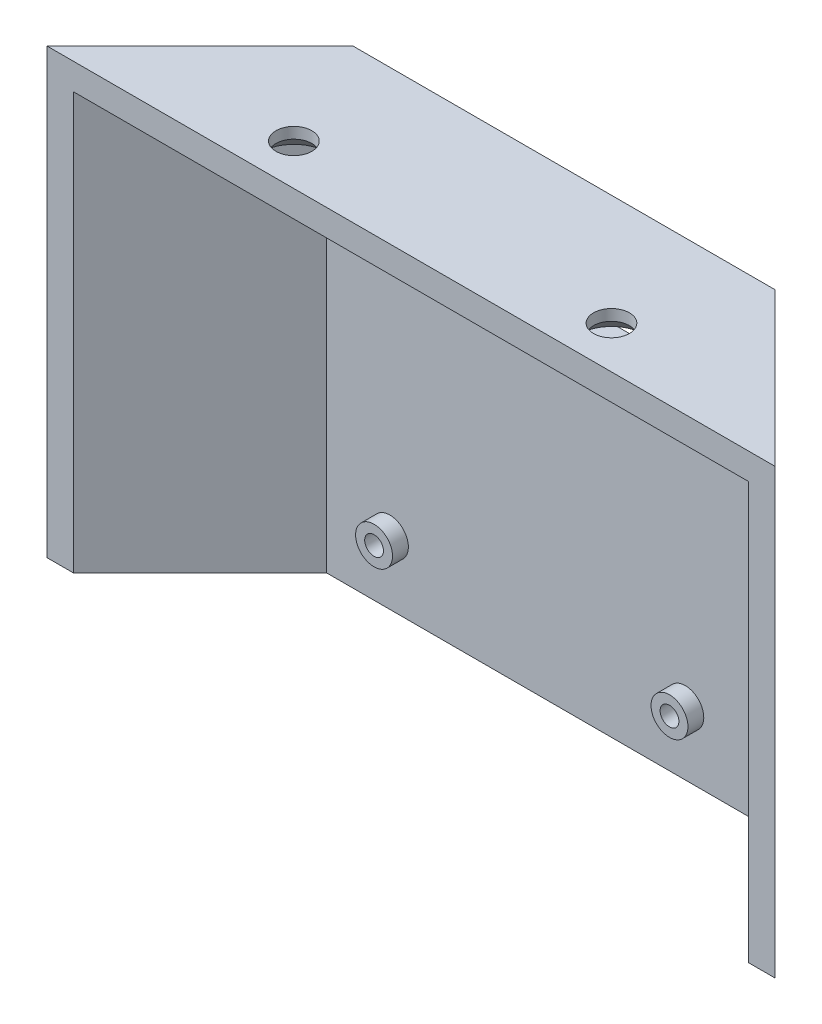
ISO-10303-21;
HEADER;
FILE_DESCRIPTION(('STEP AP214'),'2;1');
FILE_NAME('part.step','',(''),(''),'','','');
FILE_SCHEMA(('AUTOMOTIVE_DESIGN { 1 0 10303 214 1 1 1 1 }'));
ENDSEC;
DATA;
#1=APPLICATION_CONTEXT('core data for automotive mechanical design processes');
#2=APPLICATION_PROTOCOL_DEFINITION('international standard','automotive_design',2000,#1);
#3=PRODUCT_CONTEXT('',#1,'mechanical');
#4=PRODUCT('Part','Part','',(#3));
#5=PRODUCT_RELATED_PRODUCT_CATEGORY('part','',(#4));
#6=PRODUCT_DEFINITION_FORMATION('','',#4);
#7=PRODUCT_DEFINITION_CONTEXT('part definition',#1,'design');
#8=PRODUCT_DEFINITION('design','',#6,#7);
#9=PRODUCT_DEFINITION_SHAPE('','',#8);
#10=(LENGTH_UNIT() NAMED_UNIT(*) SI_UNIT(.MILLI.,.METRE.));
#11=(NAMED_UNIT(*) PLANE_ANGLE_UNIT() SI_UNIT($,.RADIAN.));
#12=(NAMED_UNIT(*) SI_UNIT($,.STERADIAN.) SOLID_ANGLE_UNIT());
#13=UNCERTAINTY_MEASURE_WITH_UNIT(LENGTH_MEASURE(1.E-05),#10,'distance_accuracy_value','');
#14=(GEOMETRIC_REPRESENTATION_CONTEXT(3) GLOBAL_UNCERTAINTY_ASSIGNED_CONTEXT((#13)) GLOBAL_UNIT_ASSIGNED_CONTEXT((#10,
#11,#12)) REPRESENTATION_CONTEXT('',''));
#15=CARTESIAN_POINT('',(0.,0.,0.));
#16=DIRECTION('',(0.,0.,1.));
#17=DIRECTION('',(1.,0.,0.));
#18=AXIS2_PLACEMENT_3D('',#15,#16,#17);
#19=CARTESIAN_POINT('',(-20.,18.5,14.5000000000001));
#20=DIRECTION('',(0.,1.,0.));
#21=DIRECTION('',(-1.,0.,0.));
#22=AXIS2_PLACEMENT_3D('',#19,#20,#21);
#23=PLANE('',#22);
#24=CARTESIAN_POINT('',(-15.,18.5,10.598331879791));
#25=DIRECTION('',(0.,-1.,0.));
#26=DIRECTION('',(1.,0.,0.));
#27=AXIS2_PLACEMENT_3D('',#24,#25,#26);
#28=CIRCLE('',#27,3.15);
#29=CARTESIAN_POINT('',(-11.85,18.5,10.598331879791));
#30=VERTEX_POINT('',#29);
#31=EDGE_CURVE('E138',#30,#30,#28,.T.);
#32=ORIENTED_EDGE('',*,*,#31,.F.);
#33=EDGE_LOOP('',(#32));
#34=FACE_BOUND('',#33,.T.);
#35=CARTESIAN_POINT('',(14.9998388469241,18.5,10.5000000000001));
#36=DIRECTION('',(0.,-1.,0.));
#37=DIRECTION('',(1.,0.,0.));
#38=AXIS2_PLACEMENT_3D('',#35,#36,#37);
#39=CIRCLE('',#38,3.15);
#40=CARTESIAN_POINT('',(18.1498388469241,18.5,10.5000000000001));
#41=VERTEX_POINT('',#40);
#42=EDGE_CURVE('E203',#41,#41,#39,.T.);
#43=ORIENTED_EDGE('',*,*,#42,.F.);
#44=EDGE_LOOP('',(#43));
#45=FACE_BOUND('',#44,.T.);
#46=DIRECTION('',(-0.707106781186551,0.,0.707106781186544));
#47=VECTOR('',#46,1.);
#48=CARTESIAN_POINT('',(-20.,18.5,2.50000000000006));
#49=LINE('',#48,#47);
#50=CARTESIAN_POINT('',(-20.,18.5,2.50000000000006));
#51=VERTEX_POINT('',#50);
#52=CARTESIAN_POINT('',(-32.0000000000001,18.5,14.5000000000001));
#53=VERTEX_POINT('',#52);
#54=EDGE_CURVE('E159',#51,#53,#49,.T.);
#55=ORIENTED_EDGE('',*,*,#54,.F.);
#56=DIRECTION('',(1.,0.,0.));
#57=VECTOR('',#56,1.);
#58=CARTESIAN_POINT('',(-20.,18.5,2.50000000000006));
#59=LINE('',#58,#57);
#60=CARTESIAN_POINT('',(20.,18.5,2.50000000000006));
#61=VERTEX_POINT('',#60);
#62=EDGE_CURVE('E311',#51,#61,#59,.T.);
#63=ORIENTED_EDGE('',*,*,#62,.T.);
#64=DIRECTION('',(-0.707106781186547,0.,-0.707106781186548));
#65=VECTOR('',#64,1.);
#66=CARTESIAN_POINT('',(20.,18.5,2.50000000000006));
#67=LINE('',#66,#65);
#68=CARTESIAN_POINT('',(32.,18.5,14.5000000000001));
#69=VERTEX_POINT('',#68);
#70=EDGE_CURVE('E173',#69,#61,#67,.T.);
#71=ORIENTED_EDGE('',*,*,#70,.F.);
#72=DIRECTION('',(1.,0.,0.));
#73=VECTOR('',#72,1.);
#74=CARTESIAN_POINT('',(-20.,18.5,14.5000000000001));
#75=LINE('',#74,#73);
#76=EDGE_CURVE('E54',#53,#69,#75,.T.);
#77=ORIENTED_EDGE('',*,*,#76,.F.);
#78=EDGE_LOOP('',(#55,#63,#71,#77));
#79=FACE_BOUND('',#78,.T.);
#80=ADVANCED_FACE('F38',(#34,#45,#79),#23,.F.);
#81=CARTESIAN_POINT('',(0.,0.,2.5));
#82=DIRECTION('',(0.,0.,-1.));
#83=DIRECTION('',(0.,1.,0.));
#84=AXIS2_PLACEMENT_3D('',#81,#82,#83);
#85=PLANE('',#84);
#86=CARTESIAN_POINT('',(14.,-15.,2.49999999999995));
#87=DIRECTION('',(0.,0.,-1.));
#88=DIRECTION('',(0.,1.,0.));
#89=AXIS2_PLACEMENT_3D('',#86,#87,#88);
#90=CIRCLE('',#89,1.75);
#91=CARTESIAN_POINT('',(14.,-13.25,2.49999999999995));
#92=VERTEX_POINT('',#91);
#93=EDGE_CURVE('E11',#92,#92,#90,.F.);
#94=ORIENTED_EDGE('',*,*,#93,.F.);
#95=EDGE_LOOP('',(#94));
#96=FACE_BOUND('',#95,.T.);
#97=CARTESIAN_POINT('',(-14.,-15.,2.49999999999995));
#98=DIRECTION('',(0.,0.,-1.));
#99=DIRECTION('',(0.,1.,0.));
#100=AXIS2_PLACEMENT_3D('',#97,#98,#99);
#101=CIRCLE('',#100,1.75);
#102=CARTESIAN_POINT('',(-14.,-13.25,2.49999999999995));
#103=VERTEX_POINT('',#102);
#104=EDGE_CURVE('E47',#103,#103,#101,.F.);
#105=ORIENTED_EDGE('',*,*,#104,.F.);
#106=EDGE_LOOP('',(#105));
#107=FACE_BOUND('',#106,.T.);
#108=CARTESIAN_POINT('',(-14.,13.,2.50000000000005));
#109=DIRECTION('',(0.,0.,-1.));
#110=DIRECTION('',(0.,1.,0.));
#111=AXIS2_PLACEMENT_3D('',#108,#109,#110);
#112=CIRCLE('',#111,1.75);
#113=CARTESIAN_POINT('',(-14.,14.75,2.50000000000005));
#114=VERTEX_POINT('',#113);
#115=EDGE_CURVE('E344',#114,#114,#112,.F.);
#116=ORIENTED_EDGE('',*,*,#115,.F.);
#117=EDGE_LOOP('',(#116));
#118=FACE_BOUND('',#117,.T.);
#119=DIRECTION('',(1.,0.,0.));
#120=VECTOR('',#119,1.);
#121=CARTESIAN_POINT('',(0.,15.5,2.50000000000005));
#122=LINE('',#121,#120);
#123=CARTESIAN_POINT('',(2.25,15.5,2.50000000000005));
#124=VERTEX_POINT('',#123);
#125=CARTESIAN_POINT('',(12.25,15.5,2.50000000000005));
#126=VERTEX_POINT('',#125);
#127=EDGE_CURVE('E251',#124,#126,#122,.T.);
#128=ORIENTED_EDGE('',*,*,#127,.T.);
#129=DIRECTION('',(0.,-1.,0.));
#130=VECTOR('',#129,1.);
#131=CARTESIAN_POINT('',(12.25,0.,2.5));
#132=LINE('',#131,#130);
#133=CARTESIAN_POINT('',(12.25,13.,2.50000000000005));
#134=VERTEX_POINT('',#133);
#135=EDGE_CURVE('E250',#126,#134,#132,.T.);
#136=ORIENTED_EDGE('',*,*,#135,.T.);
#137=CARTESIAN_POINT('',(14.,13.,2.50000000000005));
#138=DIRECTION('',(0.,0.,-1.));
#139=DIRECTION('',(0.,1.,0.));
#140=AXIS2_PLACEMENT_3D('',#137,#138,#139);
#141=CIRCLE('',#140,1.75);
#142=EDGE_CURVE('E330',#134,#134,#141,.F.);
#143=ORIENTED_EDGE('',*,*,#142,.F.);
#144=CARTESIAN_POINT('',(12.25,10.5,2.50000000000004));
#145=VERTEX_POINT('',#144);
#146=EDGE_CURVE('E236',#134,#145,#132,.T.);
#147=ORIENTED_EDGE('',*,*,#146,.T.);
#148=DIRECTION('',(-1.,0.,0.));
#149=VECTOR('',#148,1.);
#150=CARTESIAN_POINT('',(0.,10.5,2.50000000000004));
#151=LINE('',#150,#149);
#152=CARTESIAN_POINT('',(2.25,10.5,2.50000000000004));
#153=VERTEX_POINT('',#152);
#154=EDGE_CURVE('E259',#145,#153,#151,.T.);
#155=ORIENTED_EDGE('',*,*,#154,.T.);
#156=DIRECTION('',(0.,1.,0.));
#157=VECTOR('',#156,1.);
#158=CARTESIAN_POINT('',(2.25,0.,2.5));
#159=LINE('',#158,#157);
#160=EDGE_CURVE('E255',#153,#124,#159,.T.);
#161=ORIENTED_EDGE('',*,*,#160,.T.);
#162=EDGE_LOOP('',(#128,#136,#143,#147,#155,#161));
#163=FACE_BOUND('',#162,.T.);
#164=ORIENTED_EDGE('',*,*,#62,.F.);
#165=DIRECTION('',(0.,-1.,0.));
#166=VECTOR('',#165,1.);
#167=CARTESIAN_POINT('',(-20.,-21.,2.49999999999993));
#168=LINE('',#167,#166);
#169=CARTESIAN_POINT('',(-20.,-21.,2.49999999999993));
#170=VERTEX_POINT('',#169);
#171=EDGE_CURVE('E323',#51,#170,#168,.T.);
#172=ORIENTED_EDGE('',*,*,#171,.T.);
#173=DIRECTION('',(1.,0.,0.));
#174=VECTOR('',#173,1.);
#175=CARTESIAN_POINT('',(-20.,-21.,2.49999999999993));
#176=LINE('',#175,#174);
#177=CARTESIAN_POINT('',(20.,-21.,2.49999999999993));
#178=VERTEX_POINT('',#177);
#179=EDGE_CURVE('E327',#170,#178,#176,.T.);
#180=ORIENTED_EDGE('',*,*,#179,.T.);
#181=DIRECTION('',(0.,1.,0.));
#182=VECTOR('',#181,1.);
#183=CARTESIAN_POINT('',(20.,-21.,2.49999999999993));
#184=LINE('',#183,#182);
#185=EDGE_CURVE('E320',#178,#61,#184,.T.);
#186=ORIENTED_EDGE('',*,*,#185,.T.);
#187=EDGE_LOOP('',(#164,#172,#180,#186));
#188=FACE_BOUND('',#187,.T.);
#189=ADVANCED_FACE('F353',(#96,#107,#118,#163,#188),#85,.F.);
#190=CARTESIAN_POINT('',(-20.,21.,2.50000000000007));
#191=DIRECTION('',(0.,-1.,0.));
#192=DIRECTION('',(1.,0.,0.));
#193=AXIS2_PLACEMENT_3D('',#190,#191,#192);
#194=PLANE('',#193);
#195=CARTESIAN_POINT('',(-15.,21.,10.598331879791));
#196=DIRECTION('',(0.,-1.,0.));
#197=DIRECTION('',(1.,0.,0.));
#198=AXIS2_PLACEMENT_3D('',#195,#196,#197);
#199=CIRCLE('',#198,1.7);
#200=CARTESIAN_POINT('',(-13.3,21.,10.598331879791));
#201=VERTEX_POINT('',#200);
#202=EDGE_CURVE('E199',#201,#201,#199,.T.);
#203=ORIENTED_EDGE('',*,*,#202,.T.);
#204=EDGE_LOOP('',(#203));
#205=FACE_BOUND('',#204,.T.);
#206=CARTESIAN_POINT('',(14.9998388469241,21.,10.5000000000001));
#207=DIRECTION('',(0.,-1.,0.));
#208=DIRECTION('',(1.,0.,0.));
#209=AXIS2_PLACEMENT_3D('',#206,#207,#208);
#210=CIRCLE('',#209,1.7);
#211=CARTESIAN_POINT('',(16.6998388469241,21.,10.5000000000001));
#212=VERTEX_POINT('',#211);
#213=EDGE_CURVE('E211',#212,#212,#210,.T.);
#214=ORIENTED_EDGE('',*,*,#213,.T.);
#215=EDGE_LOOP('',(#214));
#216=FACE_BOUND('',#215,.T.);
#217=DIRECTION('',(-1.,0.,0.));
#218=VECTOR('',#217,1.);
#219=CARTESIAN_POINT('',(-20.,21.,0.));
#220=LINE('',#219,#218);
#221=CARTESIAN_POINT('',(20.,21.,0.));
#222=VERTEX_POINT('',#221);
#223=CARTESIAN_POINT('',(-20.,21.,0.));
#224=VERTEX_POINT('',#223);
#225=EDGE_CURVE('E333',#222,#224,#220,.T.);
#226=ORIENTED_EDGE('',*,*,#225,.T.);
#227=DIRECTION('',(-0.707106781186544,0.,0.707106781186551));
#228=VECTOR('',#227,1.);
#229=CARTESIAN_POINT('',(-20.,21.,0.));
#230=LINE('',#229,#228);
#231=CARTESIAN_POINT('',(-34.4999999999998,21.,14.5000000000001));
#232=VERTEX_POINT('',#231);
#233=EDGE_CURVE('E139',#224,#232,#230,.T.);
#234=ORIENTED_EDGE('',*,*,#233,.T.);
#235=DIRECTION('',(-1.,0.,0.));
#236=VECTOR('',#235,1.);
#237=CARTESIAN_POINT('',(-20.,21.,14.5000000000001));
#238=LINE('',#237,#236);
#239=CARTESIAN_POINT('',(34.4999999999999,21.,14.5000000000001));
#240=VERTEX_POINT('',#239);
#241=EDGE_CURVE('E133',#240,#232,#238,.T.);
#242=ORIENTED_EDGE('',*,*,#241,.F.);
#243=DIRECTION('',(-0.707106781186544,0.,-0.707106781186551));
#244=VECTOR('',#243,1.);
#245=CARTESIAN_POINT('',(20.,21.,0.));
#246=LINE('',#245,#244);
#247=EDGE_CURVE('E172',#240,#222,#246,.T.);
#248=ORIENTED_EDGE('',*,*,#247,.T.);
#249=EDGE_LOOP('',(#226,#234,#242,#248));
#250=FACE_BOUND('',#249,.T.);
#251=ADVANCED_FACE('F40',(#205,#216,#250),#194,.F.);
#252=CARTESIAN_POINT('',(-20.,-21.,2.49999999999993));
#253=DIRECTION('',(0.,1.,0.));
#254=DIRECTION('',(-1.,0.,0.));
#255=AXIS2_PLACEMENT_3D('',#252,#253,#254);
#256=PLANE('',#255);
#257=DIRECTION('',(1.,0.,0.));
#258=VECTOR('',#257,1.);
#259=CARTESIAN_POINT('',(-20.,-21.,0.));
#260=LINE('',#259,#258);
#261=CARTESIAN_POINT('',(-20.,-21.,0.));
#262=VERTEX_POINT('',#261);
#263=CARTESIAN_POINT('',(20.,-21.,0.));
#264=VERTEX_POINT('',#263);
#265=EDGE_CURVE('E324',#262,#264,#260,.T.);
#266=ORIENTED_EDGE('',*,*,#265,.T.);
#267=DIRECTION('',(-0.707106781186544,0.,-0.707106781186551));
#268=VECTOR('',#267,1.);
#269=CARTESIAN_POINT('',(20.,-21.,0.));
#270=LINE('',#269,#268);
#271=CARTESIAN_POINT('',(34.4999999999999,-21.,14.4999999999999));
#272=VERTEX_POINT('',#271);
#273=EDGE_CURVE('E167',#272,#264,#270,.T.);
#274=ORIENTED_EDGE('',*,*,#273,.F.);
#275=DIRECTION('',(1.,0.,0.));
#276=VECTOR('',#275,1.);
#277=CARTESIAN_POINT('',(34.4999999999999,-21.,14.4999999999999));
#278=LINE('',#277,#276);
#279=CARTESIAN_POINT('',(32.,-21.,14.4999999999999));
#280=VERTEX_POINT('',#279);
#281=EDGE_CURVE('E163',#280,#272,#278,.T.);
#282=ORIENTED_EDGE('',*,*,#281,.F.);
#283=DIRECTION('',(0.707106781186547,0.,0.707106781186549));
#284=VECTOR('',#283,1.);
#285=CARTESIAN_POINT('',(20.,-21.,2.49999999999993));
#286=LINE('',#285,#284);
#287=EDGE_CURVE('E168',#178,#280,#286,.T.);
#288=ORIENTED_EDGE('',*,*,#287,.F.);
#289=ORIENTED_EDGE('',*,*,#179,.F.);
#290=DIRECTION('',(0.707106781186551,0.,-0.707106781186544));
#291=VECTOR('',#290,1.);
#292=CARTESIAN_POINT('',(-20.,-21.,2.49999999999993));
#293=LINE('',#292,#291);
#294=CARTESIAN_POINT('',(-32.0000000000001,-21.,14.4999999999999));
#295=VERTEX_POINT('',#294);
#296=EDGE_CURVE('E147',#295,#170,#293,.T.);
#297=ORIENTED_EDGE('',*,*,#296,.F.);
#298=DIRECTION('',(1.,0.,0.));
#299=VECTOR('',#298,1.);
#300=CARTESIAN_POINT('',(-32.0000000000001,-21.,14.4999999999999));
#301=LINE('',#300,#299);
#302=CARTESIAN_POINT('',(-34.4999999999998,-21.,14.4999999999999));
#303=VERTEX_POINT('',#302);
#304=EDGE_CURVE('E131',#303,#295,#301,.T.);
#305=ORIENTED_EDGE('',*,*,#304,.F.);
#306=DIRECTION('',(-0.707106781186544,0.,0.707106781186551));
#307=VECTOR('',#306,1.);
#308=CARTESIAN_POINT('',(-34.4999999999998,-21.,14.4999999999999));
#309=LINE('',#308,#307);
#310=EDGE_CURVE('E144',#262,#303,#309,.T.);
#311=ORIENTED_EDGE('',*,*,#310,.F.);
#312=EDGE_LOOP('',(#266,#274,#282,#288,#289,#297,#305,#311));
#313=FACE_BOUND('',#312,.T.);
#314=ADVANCED_FACE('F143',(#313),#256,.F.);
#315=CARTESIAN_POINT('',(0.,0.,0.));
#316=DIRECTION('',(0.,0.,-1.));
#317=DIRECTION('',(0.,1.,0.));
#318=AXIS2_PLACEMENT_3D('',#315,#316,#317);
#319=PLANE('',#318);
#320=DIRECTION('',(0.,1.,0.));
#321=VECTOR('',#320,1.);
#322=CARTESIAN_POINT('',(12.25,10.5,0.));
#323=LINE('',#322,#321);
#324=CARTESIAN_POINT('',(12.25,10.5,0.));
#325=VERTEX_POINT('',#324);
#326=CARTESIAN_POINT('',(12.25,15.5,0.));
#327=VERTEX_POINT('',#326);
#328=EDGE_CURVE('E215',#325,#327,#323,.T.);
#329=ORIENTED_EDGE('',*,*,#328,.T.);
#330=DIRECTION('',(-1.,0.,0.));
#331=VECTOR('',#330,1.);
#332=CARTESIAN_POINT('',(2.25,15.5,0.));
#333=LINE('',#332,#331);
#334=CARTESIAN_POINT('',(2.25,15.5,0.));
#335=VERTEX_POINT('',#334);
#336=EDGE_CURVE('E219',#327,#335,#333,.T.);
#337=ORIENTED_EDGE('',*,*,#336,.T.);
#338=DIRECTION('',(0.,-1.,0.));
#339=VECTOR('',#338,1.);
#340=CARTESIAN_POINT('',(2.25,10.5,0.));
#341=LINE('',#340,#339);
#342=CARTESIAN_POINT('',(2.25,10.5,0.));
#343=VERTEX_POINT('',#342);
#344=EDGE_CURVE('E223',#335,#343,#341,.T.);
#345=ORIENTED_EDGE('',*,*,#344,.T.);
#346=DIRECTION('',(1.,0.,0.));
#347=VECTOR('',#346,1.);
#348=CARTESIAN_POINT('',(2.25,10.5,0.));
#349=LINE('',#348,#347);
#350=EDGE_CURVE('E227',#343,#325,#349,.T.);
#351=ORIENTED_EDGE('',*,*,#350,.T.);
#352=EDGE_LOOP('',(#329,#337,#345,#351));
#353=FACE_BOUND('',#352,.T.);
#354=CARTESIAN_POINT('',(-14.,-15.,0.));
#355=DIRECTION('',(0.,0.,1.));
#356=DIRECTION('',(0.,-1.,0.));
#357=AXIS2_PLACEMENT_3D('',#354,#355,#356);
#358=CIRCLE('',#357,0.89);
#359=CARTESIAN_POINT('',(-14.,-15.89,0.));
#360=VERTEX_POINT('',#359);
#361=EDGE_CURVE('E281',#360,#360,#358,.T.);
#362=ORIENTED_EDGE('',*,*,#361,.T.);
#363=EDGE_LOOP('',(#362));
#364=FACE_BOUND('',#363,.T.);
#365=CARTESIAN_POINT('',(14.,-15.,0.));
#366=DIRECTION('',(0.,0.,1.));
#367=DIRECTION('',(0.,-1.,0.));
#368=AXIS2_PLACEMENT_3D('',#365,#366,#367);
#369=CIRCLE('',#368,0.89);
#370=CARTESIAN_POINT('',(14.,-15.89,0.));
#371=VERTEX_POINT('',#370);
#372=EDGE_CURVE('E273',#371,#371,#369,.T.);
#373=ORIENTED_EDGE('',*,*,#372,.T.);
#374=EDGE_LOOP('',(#373));
#375=FACE_BOUND('',#374,.T.);
#376=CARTESIAN_POINT('',(14.,13.,0.));
#377=DIRECTION('',(0.,0.,1.));
#378=DIRECTION('',(0.,-1.,0.));
#379=AXIS2_PLACEMENT_3D('',#376,#377,#378);
#380=CIRCLE('',#379,0.89);
#381=CARTESIAN_POINT('',(14.,12.11,0.));
#382=VERTEX_POINT('',#381);
#383=EDGE_CURVE('E264',#382,#382,#380,.T.);
#384=ORIENTED_EDGE('',*,*,#383,.T.);
#385=EDGE_LOOP('',(#384));
#386=FACE_BOUND('',#385,.T.);
#387=CARTESIAN_POINT('',(-14.,13.,0.));
#388=DIRECTION('',(0.,0.,1.));
#389=DIRECTION('',(0.,-1.,0.));
#390=AXIS2_PLACEMENT_3D('',#387,#388,#389);
#391=CIRCLE('',#390,0.89);
#392=CARTESIAN_POINT('',(-14.,12.11,0.));
#393=VERTEX_POINT('',#392);
#394=EDGE_CURVE('E288',#393,#393,#391,.T.);
#395=ORIENTED_EDGE('',*,*,#394,.T.);
#396=EDGE_LOOP('',(#395));
#397=FACE_BOUND('',#396,.T.);
#398=DIRECTION('',(0.,1.,0.));
#399=VECTOR('',#398,1.);
#400=CARTESIAN_POINT('',(20.,-21.,0.));
#401=LINE('',#400,#399);
#402=EDGE_CURVE('E316',#264,#222,#401,.T.);
#403=ORIENTED_EDGE('',*,*,#402,.F.);
#404=ORIENTED_EDGE('',*,*,#265,.F.);
#405=DIRECTION('',(0.,-1.,0.));
#406=VECTOR('',#405,1.);
#407=CARTESIAN_POINT('',(-20.,-21.,0.));
#408=LINE('',#407,#406);
#409=EDGE_CURVE('E153',#224,#262,#408,.T.);
#410=ORIENTED_EDGE('',*,*,#409,.F.);
#411=ORIENTED_EDGE('',*,*,#225,.F.);
#412=EDGE_LOOP('',(#403,#404,#410,#411));
#413=FACE_BOUND('',#412,.T.);
#414=ADVANCED_FACE('F403',(#353,#364,#375,#386,#397,#413),#319,.T.);
#415=CARTESIAN_POINT('',(0.,0.,14.5));
#416=DIRECTION('',(0.,0.,1.));
#417=DIRECTION('',(0.,-1.,0.));
#418=AXIS2_PLACEMENT_3D('',#415,#416,#417);
#419=PLANE('',#418);
#420=ORIENTED_EDGE('',*,*,#241,.T.);
#421=DIRECTION('',(0.,1.,0.));
#422=VECTOR('',#421,1.);
#423=CARTESIAN_POINT('',(-34.4999999999998,-2.00609665440981,14.5));
#424=LINE('',#423,#422);
#425=EDGE_CURVE('E128',#303,#232,#424,.T.);
#426=ORIENTED_EDGE('',*,*,#425,.F.);
#427=ORIENTED_EDGE('',*,*,#304,.T.);
#428=DIRECTION('',(0.,1.,0.));
#429=VECTOR('',#428,1.);
#430=CARTESIAN_POINT('',(-32.0000000000001,-41.5060966544098,14.4999999999999));
#431=LINE('',#430,#429);
#432=EDGE_CURVE('E156',#295,#53,#431,.T.);
#433=ORIENTED_EDGE('',*,*,#432,.T.);
#434=ORIENTED_EDGE('',*,*,#76,.T.);
#435=DIRECTION('',(0.,1.,0.));
#436=VECTOR('',#435,1.);
#437=CARTESIAN_POINT('',(32.,-41.5060966544098,14.4999999999999));
#438=LINE('',#437,#436);
#439=EDGE_CURVE('E177',#280,#69,#438,.T.);
#440=ORIENTED_EDGE('',*,*,#439,.F.);
#441=ORIENTED_EDGE('',*,*,#281,.T.);
#442=DIRECTION('',(0.,1.,0.));
#443=VECTOR('',#442,1.);
#444=CARTESIAN_POINT('',(34.4999999999999,-2.00609665440981,14.5));
#445=LINE('',#444,#443);
#446=EDGE_CURVE('E187',#272,#240,#445,.T.);
#447=ORIENTED_EDGE('',*,*,#446,.T.);
#448=EDGE_LOOP('',(#420,#426,#427,#433,#434,#440,#441,#447));
#449=FACE_BOUND('',#448,.T.);
#450=ADVANCED_FACE('F130',(#449),#419,.T.);
#451=CARTESIAN_POINT('',(14.,13.,4.00000000000005));
#452=DIRECTION('',(0.,0.,-1.));
#453=DIRECTION('',(0.,1.,0.));
#454=AXIS2_PLACEMENT_3D('',#451,#452,#453);
#455=CYLINDRICAL_SURFACE('',#454,1.75);
#456=ORIENTED_EDGE('',*,*,#142,.T.);
#457=EDGE_LOOP('',(#456));
#458=FACE_BOUND('',#457,.T.);
#459=CARTESIAN_POINT('',(14.,13.,4.00000000000005));
#460=DIRECTION('',(0.,0.,1.));
#461=DIRECTION('',(0.,-1.,0.));
#462=AXIS2_PLACEMENT_3D('',#459,#460,#461);
#463=CIRCLE('',#462,1.75);
#464=CARTESIAN_POINT('',(14.,11.25,4.00000000000004));
#465=VERTEX_POINT('',#464);
#466=EDGE_CURVE('E307',#465,#465,#463,.T.);
#467=ORIENTED_EDGE('',*,*,#466,.F.);
#468=EDGE_LOOP('',(#467));
#469=FACE_BOUND('',#468,.T.);
#470=ADVANCED_FACE('F376',(#458,#469),#455,.T.);
#471=CARTESIAN_POINT('',(14.,13.,4.00000000000005));
#472=DIRECTION('',(0.,0.,1.));
#473=DIRECTION('',(0.,-1.,0.));
#474=AXIS2_PLACEMENT_3D('',#471,#472,#473);
#475=PLANE('',#474);
#476=CARTESIAN_POINT('',(14.,13.,4.00000000000005));
#477=DIRECTION('',(0.,0.,1.));
#478=DIRECTION('',(0.,-1.,0.));
#479=AXIS2_PLACEMENT_3D('',#476,#477,#478);
#480=CIRCLE('',#479,0.89);
#481=CARTESIAN_POINT('',(14.,12.11,4.00000000000004));
#482=VERTEX_POINT('',#481);
#483=EDGE_CURVE('E269',#482,#482,#480,.T.);
#484=ORIENTED_EDGE('',*,*,#483,.F.);
#485=EDGE_LOOP('',(#484));
#486=FACE_BOUND('',#485,.T.);
#487=ORIENTED_EDGE('',*,*,#466,.T.);
#488=EDGE_LOOP('',(#487));
#489=FACE_BOUND('',#488,.T.);
#490=ADVANCED_FACE('F379',(#486,#489),#475,.T.);
#491=CARTESIAN_POINT('',(-14.,13.,4.00000000000005));
#492=DIRECTION('',(0.,0.,-1.));
#493=DIRECTION('',(0.,1.,0.));
#494=AXIS2_PLACEMENT_3D('',#491,#492,#493);
#495=CYLINDRICAL_SURFACE('',#494,1.75);
#496=CARTESIAN_POINT('',(-14.,13.,4.00000000000005));
#497=DIRECTION('',(0.,0.,1.));
#498=DIRECTION('',(0.,-1.,0.));
#499=AXIS2_PLACEMENT_3D('',#496,#497,#498);
#500=CIRCLE('',#499,1.75);
#501=CARTESIAN_POINT('',(-14.,11.25,4.00000000000004));
#502=VERTEX_POINT('',#501);
#503=EDGE_CURVE('E303',#502,#502,#500,.T.);
#504=ORIENTED_EDGE('',*,*,#503,.F.);
#505=EDGE_LOOP('',(#504));
#506=FACE_BOUND('',#505,.T.);
#507=ORIENTED_EDGE('',*,*,#115,.T.);
#508=EDGE_LOOP('',(#507));
#509=FACE_BOUND('',#508,.T.);
#510=ADVANCED_FACE('F384',(#506,#509),#495,.T.);
#511=CARTESIAN_POINT('',(-14.,13.,4.00000000000005));
#512=DIRECTION('',(0.,0.,1.));
#513=DIRECTION('',(0.,-1.,0.));
#514=AXIS2_PLACEMENT_3D('',#511,#512,#513);
#515=PLANE('',#514);
#516=CARTESIAN_POINT('',(-14.,13.,4.00000000000005));
#517=DIRECTION('',(0.,0.,1.));
#518=DIRECTION('',(0.,-1.,0.));
#519=AXIS2_PLACEMENT_3D('',#516,#517,#518);
#520=CIRCLE('',#519,0.89);
#521=CARTESIAN_POINT('',(-14.,12.11,4.00000000000004));
#522=VERTEX_POINT('',#521);
#523=EDGE_CURVE('E268',#522,#522,#520,.T.);
#524=ORIENTED_EDGE('',*,*,#523,.F.);
#525=EDGE_LOOP('',(#524));
#526=FACE_BOUND('',#525,.T.);
#527=ORIENTED_EDGE('',*,*,#503,.T.);
#528=EDGE_LOOP('',(#527));
#529=FACE_BOUND('',#528,.T.);
#530=ADVANCED_FACE('F390',(#526,#529),#515,.T.);
#531=CARTESIAN_POINT('',(-14.,-15.,3.99999999999995));
#532=DIRECTION('',(0.,0.,-1.));
#533=DIRECTION('',(0.,1.,0.));
#534=AXIS2_PLACEMENT_3D('',#531,#532,#533);
#535=CYLINDRICAL_SURFACE('',#534,1.75);
#536=CARTESIAN_POINT('',(-14.,-15.,3.99999999999995));
#537=DIRECTION('',(0.,0.,1.));
#538=DIRECTION('',(0.,-1.,0.));
#539=AXIS2_PLACEMENT_3D('',#536,#537,#538);
#540=CIRCLE('',#539,1.75);
#541=CARTESIAN_POINT('',(-14.,-16.75,3.99999999999994));
#542=VERTEX_POINT('',#541);
#543=EDGE_CURVE('E299',#542,#542,#540,.T.);
#544=ORIENTED_EDGE('',*,*,#543,.F.);
#545=EDGE_LOOP('',(#544));
#546=FACE_BOUND('',#545,.T.);
#547=ORIENTED_EDGE('',*,*,#104,.T.);
#548=EDGE_LOOP('',(#547));
#549=FACE_BOUND('',#548,.T.);
#550=ADVANCED_FACE('F351',(#546,#549),#535,.T.);
#551=CARTESIAN_POINT('',(-14.,-15.,3.99999999999995));
#552=DIRECTION('',(0.,0.,1.));
#553=DIRECTION('',(0.,-1.,0.));
#554=AXIS2_PLACEMENT_3D('',#551,#552,#553);
#555=PLANE('',#554);
#556=CARTESIAN_POINT('',(-14.,-15.,3.99999999999995));
#557=DIRECTION('',(0.,0.,1.));
#558=DIRECTION('',(0.,-1.,0.));
#559=AXIS2_PLACEMENT_3D('',#556,#557,#558);
#560=CIRCLE('',#559,0.89);
#561=CARTESIAN_POINT('',(-14.,-15.89,3.99999999999994));
#562=VERTEX_POINT('',#561);
#563=EDGE_CURVE('E263',#562,#562,#560,.T.);
#564=ORIENTED_EDGE('',*,*,#563,.F.);
#565=EDGE_LOOP('',(#564));
#566=FACE_BOUND('',#565,.T.);
#567=ORIENTED_EDGE('',*,*,#543,.T.);
#568=EDGE_LOOP('',(#567));
#569=FACE_BOUND('',#568,.T.);
#570=ADVANCED_FACE('F492',(#566,#569),#555,.T.);
#571=CARTESIAN_POINT('',(14.,-15.,3.99999999999995));
#572=DIRECTION('',(0.,0.,-1.));
#573=DIRECTION('',(0.,1.,0.));
#574=AXIS2_PLACEMENT_3D('',#571,#572,#573);
#575=CYLINDRICAL_SURFACE('',#574,1.75);
#576=CARTESIAN_POINT('',(14.,-15.,3.99999999999995));
#577=DIRECTION('',(0.,0.,1.));
#578=DIRECTION('',(0.,-1.,0.));
#579=AXIS2_PLACEMENT_3D('',#576,#577,#578);
#580=CIRCLE('',#579,1.75);
#581=CARTESIAN_POINT('',(14.,-16.75,3.99999999999994));
#582=VERTEX_POINT('',#581);
#583=EDGE_CURVE('E292',#582,#582,#580,.T.);
#584=ORIENTED_EDGE('',*,*,#583,.F.);
#585=EDGE_LOOP('',(#584));
#586=FACE_BOUND('',#585,.T.);
#587=ORIENTED_EDGE('',*,*,#93,.T.);
#588=EDGE_LOOP('',(#587));
#589=FACE_BOUND('',#588,.T.);
#590=ADVANCED_FACE('F488',(#586,#589),#575,.T.);
#591=CARTESIAN_POINT('',(14.,-15.,3.99999999999995));
#592=DIRECTION('',(0.,0.,1.));
#593=DIRECTION('',(0.,-1.,0.));
#594=AXIS2_PLACEMENT_3D('',#591,#592,#593);
#595=PLANE('',#594);
#596=CARTESIAN_POINT('',(14.,-15.,3.99999999999995));
#597=DIRECTION('',(0.,0.,1.));
#598=DIRECTION('',(0.,-1.,0.));
#599=AXIS2_PLACEMENT_3D('',#596,#597,#598);
#600=CIRCLE('',#599,0.89);
#601=CARTESIAN_POINT('',(14.,-15.89,3.99999999999994));
#602=VERTEX_POINT('',#601);
#603=EDGE_CURVE('E277',#602,#602,#600,.T.);
#604=ORIENTED_EDGE('',*,*,#603,.F.);
#605=EDGE_LOOP('',(#604));
#606=FACE_BOUND('',#605,.T.);
#607=ORIENTED_EDGE('',*,*,#583,.T.);
#608=EDGE_LOOP('',(#607));
#609=FACE_BOUND('',#608,.T.);
#610=ADVANCED_FACE('F478',(#606,#609),#595,.T.);
#611=CARTESIAN_POINT('',(14.,-15.,0.));
#612=DIRECTION('',(0.,0.,1.));
#613=DIRECTION('',(0.,-1.,0.));
#614=AXIS2_PLACEMENT_3D('',#611,#612,#613);
#615=CYLINDRICAL_SURFACE('',#614,0.89);
#616=ORIENTED_EDGE('',*,*,#372,.F.);
#617=EDGE_LOOP('',(#616));
#618=FACE_BOUND('',#617,.T.);
#619=ORIENTED_EDGE('',*,*,#603,.T.);
#620=EDGE_LOOP('',(#619));
#621=FACE_BOUND('',#620,.T.);
#622=ADVANCED_FACE('F474',(#618,#621),#615,.F.);
#623=CARTESIAN_POINT('',(-14.,-15.,0.));
#624=DIRECTION('',(0.,0.,1.));
#625=DIRECTION('',(0.,-1.,0.));
#626=AXIS2_PLACEMENT_3D('',#623,#624,#625);
#627=CYLINDRICAL_SURFACE('',#626,0.89);
#628=ORIENTED_EDGE('',*,*,#361,.F.);
#629=EDGE_LOOP('',(#628));
#630=FACE_BOUND('',#629,.T.);
#631=ORIENTED_EDGE('',*,*,#563,.T.);
#632=EDGE_LOOP('',(#631));
#633=FACE_BOUND('',#632,.T.);
#634=ADVANCED_FACE('F477',(#630,#633),#627,.F.);
#635=CARTESIAN_POINT('',(-14.,13.,0.));
#636=DIRECTION('',(0.,0.,1.));
#637=DIRECTION('',(0.,-1.,0.));
#638=AXIS2_PLACEMENT_3D('',#635,#636,#637);
#639=CYLINDRICAL_SURFACE('',#638,0.89);
#640=ORIENTED_EDGE('',*,*,#394,.F.);
#641=EDGE_LOOP('',(#640));
#642=FACE_BOUND('',#641,.T.);
#643=ORIENTED_EDGE('',*,*,#523,.T.);
#644=EDGE_LOOP('',(#643));
#645=FACE_BOUND('',#644,.T.);
#646=ADVANCED_FACE('F472',(#642,#645),#639,.F.);
#647=CARTESIAN_POINT('',(14.,13.,0.));
#648=DIRECTION('',(0.,0.,1.));
#649=DIRECTION('',(0.,-1.,0.));
#650=AXIS2_PLACEMENT_3D('',#647,#648,#649);
#651=CYLINDRICAL_SURFACE('',#650,0.89);
#652=ORIENTED_EDGE('',*,*,#383,.F.);
#653=EDGE_LOOP('',(#652));
#654=FACE_BOUND('',#653,.T.);
#655=ORIENTED_EDGE('',*,*,#483,.T.);
#656=EDGE_LOOP('',(#655));
#657=FACE_BOUND('',#656,.T.);
#658=ADVANCED_FACE('F459',(#654,#657),#651,.F.);
#659=CARTESIAN_POINT('',(2.25,10.5,0.));
#660=DIRECTION('',(0.,-1.,0.));
#661=DIRECTION('',(1.,0.,0.));
#662=AXIS2_PLACEMENT_3D('',#659,#660,#661);
#663=PLANE('',#662);
#664=DIRECTION('',(0.,0.,1.));
#665=VECTOR('',#664,1.);
#666=CARTESIAN_POINT('',(12.25,10.5,0.));
#667=LINE('',#666,#665);
#668=EDGE_CURVE('E232',#325,#145,#667,.T.);
#669=ORIENTED_EDGE('',*,*,#668,.F.);
#670=ORIENTED_EDGE('',*,*,#350,.F.);
#671=DIRECTION('',(0.,0.,1.));
#672=VECTOR('',#671,1.);
#673=CARTESIAN_POINT('',(2.25,10.5,0.));
#674=LINE('',#673,#672);
#675=EDGE_CURVE('E237',#343,#153,#674,.T.);
#676=ORIENTED_EDGE('',*,*,#675,.T.);
#677=ORIENTED_EDGE('',*,*,#154,.F.);
#678=EDGE_LOOP('',(#669,#670,#676,#677));
#679=FACE_BOUND('',#678,.T.);
#680=ADVANCED_FACE('F455',(#679),#663,.F.);
#681=CARTESIAN_POINT('',(2.25,10.5,0.));
#682=DIRECTION('',(-1.,0.,0.));
#683=DIRECTION('',(0.,-1.,0.));
#684=AXIS2_PLACEMENT_3D('',#681,#682,#683);
#685=PLANE('',#684);
#686=ORIENTED_EDGE('',*,*,#675,.F.);
#687=ORIENTED_EDGE('',*,*,#344,.F.);
#688=DIRECTION('',(0.,0.,1.));
#689=VECTOR('',#688,1.);
#690=CARTESIAN_POINT('',(2.25,15.5,0.));
#691=LINE('',#690,#689);
#692=EDGE_CURVE('E241',#335,#124,#691,.T.);
#693=ORIENTED_EDGE('',*,*,#692,.T.);
#694=ORIENTED_EDGE('',*,*,#160,.F.);
#695=EDGE_LOOP('',(#686,#687,#693,#694));
#696=FACE_BOUND('',#695,.T.);
#697=ADVANCED_FACE('F458',(#696),#685,.F.);
#698=CARTESIAN_POINT('',(2.25,15.5,0.));
#699=DIRECTION('',(0.,1.,0.));
#700=DIRECTION('',(-1.,0.,0.));
#701=AXIS2_PLACEMENT_3D('',#698,#699,#700);
#702=PLANE('',#701);
#703=ORIENTED_EDGE('',*,*,#692,.F.);
#704=ORIENTED_EDGE('',*,*,#336,.F.);
#705=DIRECTION('',(0.,0.,1.));
#706=VECTOR('',#705,1.);
#707=CARTESIAN_POINT('',(12.25,15.5,0.));
#708=LINE('',#707,#706);
#709=EDGE_CURVE('E231',#327,#126,#708,.T.);
#710=ORIENTED_EDGE('',*,*,#709,.T.);
#711=ORIENTED_EDGE('',*,*,#127,.F.);
#712=EDGE_LOOP('',(#703,#704,#710,#711));
#713=FACE_BOUND('',#712,.T.);
#714=ADVANCED_FACE('F463',(#713),#702,.F.);
#715=CARTESIAN_POINT('',(12.25,10.5,0.));
#716=DIRECTION('',(1.,0.,0.));
#717=DIRECTION('',(0.,1.,0.));
#718=AXIS2_PLACEMENT_3D('',#715,#716,#717);
#719=PLANE('',#718);
#720=ORIENTED_EDGE('',*,*,#709,.F.);
#721=ORIENTED_EDGE('',*,*,#328,.F.);
#722=ORIENTED_EDGE('',*,*,#668,.T.);
#723=ORIENTED_EDGE('',*,*,#146,.F.);
#724=ORIENTED_EDGE('',*,*,#135,.F.);
#725=EDGE_LOOP('',(#720,#721,#722,#723,#724));
#726=FACE_BOUND('',#725,.T.);
#727=ADVANCED_FACE('F453',(#726),#719,.F.);
#728=CARTESIAN_POINT('',(14.9998388469241,18.5,10.5000000000001));
#729=DIRECTION('',(0.,-1.,0.));
#730=DIRECTION('',(1.,0.,0.));
#731=AXIS2_PLACEMENT_3D('',#728,#729,#730);
#732=CYLINDRICAL_SURFACE('',#731,1.7);
#733=ORIENTED_EDGE('',*,*,#213,.F.);
#734=EDGE_LOOP('',(#733));
#735=FACE_BOUND('',#734,.T.);
#736=CARTESIAN_POINT('',(14.9998388469241,19.95,10.5000000000001));
#737=DIRECTION('',(0.,-1.,0.));
#738=DIRECTION('',(1.,0.,0.));
#739=AXIS2_PLACEMENT_3D('',#736,#737,#738);
#740=CIRCLE('',#739,1.7);
#741=CARTESIAN_POINT('',(16.6998388469241,19.95,10.5000000000001));
#742=VERTEX_POINT('',#741);
#743=EDGE_CURVE('E207',#742,#742,#740,.T.);
#744=ORIENTED_EDGE('',*,*,#743,.T.);
#745=EDGE_LOOP('',(#744));
#746=FACE_BOUND('',#745,.T.);
#747=ADVANCED_FACE('F449',(#735,#746),#732,.F.);
#748=CARTESIAN_POINT('',(14.9998388469241,18.5,10.5000000000001));
#749=DIRECTION('',(0.,-1.,0.));
#750=DIRECTION('',(1.,0.,0.));
#751=AXIS2_PLACEMENT_3D('',#748,#749,#750);
#752=CONICAL_SURFACE('',#751,3.15,0.785398163397448);
#753=ORIENTED_EDGE('',*,*,#743,.F.);
#754=EDGE_LOOP('',(#753));
#755=FACE_BOUND('',#754,.T.);
#756=ORIENTED_EDGE('',*,*,#42,.T.);
#757=EDGE_LOOP('',(#756));
#758=FACE_BOUND('',#757,.T.);
#759=ADVANCED_FACE('F445',(#755,#758),#752,.F.);
#760=CARTESIAN_POINT('',(-15.,18.5,10.598331879791));
#761=DIRECTION('',(0.,-1.,0.));
#762=DIRECTION('',(1.,0.,0.));
#763=AXIS2_PLACEMENT_3D('',#760,#761,#762);
#764=CYLINDRICAL_SURFACE('',#763,1.7);
#765=ORIENTED_EDGE('',*,*,#202,.F.);
#766=EDGE_LOOP('',(#765));
#767=FACE_BOUND('',#766,.T.);
#768=CARTESIAN_POINT('',(-15.,19.95,10.598331879791));
#769=DIRECTION('',(0.,-1.,0.));
#770=DIRECTION('',(1.,0.,0.));
#771=AXIS2_PLACEMENT_3D('',#768,#769,#770);
#772=CIRCLE('',#771,1.7);
#773=CARTESIAN_POINT('',(-13.3,19.95,10.598331879791));
#774=VERTEX_POINT('',#773);
#775=EDGE_CURVE('E195',#774,#774,#772,.T.);
#776=ORIENTED_EDGE('',*,*,#775,.T.);
#777=EDGE_LOOP('',(#776));
#778=FACE_BOUND('',#777,.T.);
#779=ADVANCED_FACE('F441',(#767,#778),#764,.F.);
#780=CARTESIAN_POINT('',(-15.,18.5,10.598331879791));
#781=DIRECTION('',(0.,-1.,0.));
#782=DIRECTION('',(1.,0.,0.));
#783=AXIS2_PLACEMENT_3D('',#780,#781,#782);
#784=CONICAL_SURFACE('',#783,3.15,0.785398163397448);
#785=ORIENTED_EDGE('',*,*,#775,.F.);
#786=EDGE_LOOP('',(#785));
#787=FACE_BOUND('',#786,.T.);
#788=ORIENTED_EDGE('',*,*,#31,.T.);
#789=EDGE_LOOP('',(#788));
#790=FACE_BOUND('',#789,.T.);
#791=ADVANCED_FACE('F438',(#787,#790),#784,.F.);
#792=CARTESIAN_POINT('',(-20.,-2.00609665440976,0.));
#793=DIRECTION('',(-0.707106781186551,0.,-0.707106781186544));
#794=DIRECTION('',(0.707106781186544,0.,-0.707106781186551));
#795=AXIS2_PLACEMENT_3D('',#792,#793,#794);
#796=PLANE('',#795);
#797=ORIENTED_EDGE('',*,*,#409,.T.);
#798=ORIENTED_EDGE('',*,*,#310,.T.);
#799=ORIENTED_EDGE('',*,*,#425,.T.);
#800=ORIENTED_EDGE('',*,*,#233,.F.);
#801=EDGE_LOOP('',(#797,#798,#799,#800));
#802=FACE_BOUND('',#801,.T.);
#803=ADVANCED_FACE('F151',(#802),#796,.T.);
#804=CARTESIAN_POINT('',(20.,-2.00609665440976,0.));
#805=DIRECTION('',(0.707106781186551,0.,-0.707106781186544));
#806=DIRECTION('',(0.707106781186544,0.,0.707106781186551));
#807=AXIS2_PLACEMENT_3D('',#804,#805,#806);
#808=PLANE('',#807);
#809=ORIENTED_EDGE('',*,*,#446,.F.);
#810=ORIENTED_EDGE('',*,*,#273,.T.);
#811=ORIENTED_EDGE('',*,*,#402,.T.);
#812=ORIENTED_EDGE('',*,*,#247,.F.);
#813=EDGE_LOOP('',(#809,#810,#811,#812));
#814=FACE_BOUND('',#813,.T.);
#815=ADVANCED_FACE('F427',(#814),#808,.T.);
#816=CARTESIAN_POINT('',(20.,-41.5060966544098,2.49999999999986));
#817=DIRECTION('',(0.707106781186549,0.,-0.707106781186547));
#818=DIRECTION('',(0.707106781186547,0.,0.707106781186549));
#819=AXIS2_PLACEMENT_3D('',#816,#817,#818);
#820=PLANE('',#819);
#821=ORIENTED_EDGE('',*,*,#185,.F.);
#822=ORIENTED_EDGE('',*,*,#287,.T.);
#823=ORIENTED_EDGE('',*,*,#439,.T.);
#824=ORIENTED_EDGE('',*,*,#70,.T.);
#825=EDGE_LOOP('',(#821,#822,#823,#824));
#826=FACE_BOUND('',#825,.T.);
#827=ADVANCED_FACE('F425',(#826),#820,.F.);
#828=CARTESIAN_POINT('',(-20.,-41.5060966544098,2.49999999999986));
#829=DIRECTION('',(-0.707106781186544,0.,-0.707106781186551));
#830=DIRECTION('',(0.707106781186551,0.,-0.707106781186544));
#831=AXIS2_PLACEMENT_3D('',#828,#829,#830);
#832=PLANE('',#831);
#833=ORIENTED_EDGE('',*,*,#432,.F.);
#834=ORIENTED_EDGE('',*,*,#296,.T.);
#835=ORIENTED_EDGE('',*,*,#171,.F.);
#836=ORIENTED_EDGE('',*,*,#54,.T.);
#837=EDGE_LOOP('',(#833,#834,#835,#836));
#838=FACE_BOUND('',#837,.T.);
#839=ADVANCED_FACE('F367',(#838),#832,.F.);
#840=CLOSED_SHELL('',(#80,#189,#251,#314,#414,#450,#470,#490,#510,#530,#550,#570,#590,#610,#622,
#634,#646,#658,#680,#697,#714,#727,#747,#759,#779,#791,#803,#815,#827,#839));
#841=MANIFOLD_SOLID_BREP('B2',#840);
#842=ADVANCED_BREP_SHAPE_REPRESENTATION('',(#18,#841),#14);
#843=SHAPE_DEFINITION_REPRESENTATION(#9,#842);
ENDSEC;
END-ISO-10303-21;
